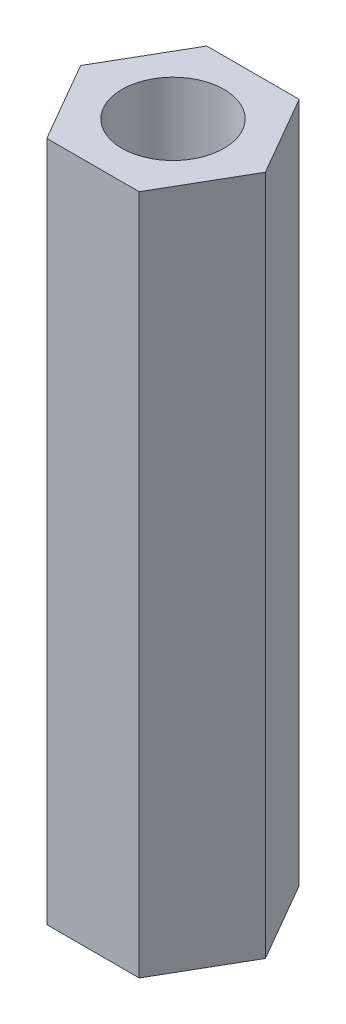
ISO-10303-21;
HEADER;
FILE_DESCRIPTION(('STEP AP214'),'2;1');
FILE_NAME('part.step','',(''),(''),'','','');
FILE_SCHEMA(('AUTOMOTIVE_DESIGN { 1 0 10303 214 1 1 1 1 }'));
ENDSEC;
DATA;
#1=APPLICATION_CONTEXT('core data for automotive mechanical design processes');
#2=APPLICATION_PROTOCOL_DEFINITION('international standard','automotive_design',2000,#1);
#3=PRODUCT_CONTEXT('',#1,'mechanical');
#4=PRODUCT('Part','Part','',(#3));
#5=PRODUCT_RELATED_PRODUCT_CATEGORY('part','',(#4));
#6=PRODUCT_DEFINITION_FORMATION('','',#4);
#7=PRODUCT_DEFINITION_CONTEXT('part definition',#1,'design');
#8=PRODUCT_DEFINITION('design','',#6,#7);
#9=PRODUCT_DEFINITION_SHAPE('','',#8);
#10=(LENGTH_UNIT() NAMED_UNIT(*) SI_UNIT(.MILLI.,.METRE.));
#11=(NAMED_UNIT(*) PLANE_ANGLE_UNIT() SI_UNIT($,.RADIAN.));
#12=(NAMED_UNIT(*) SI_UNIT($,.STERADIAN.) SOLID_ANGLE_UNIT());
#13=UNCERTAINTY_MEASURE_WITH_UNIT(LENGTH_MEASURE(1.E-05),#10,'distance_accuracy_value','');
#14=(GEOMETRIC_REPRESENTATION_CONTEXT(3) GLOBAL_UNCERTAINTY_ASSIGNED_CONTEXT((#13)) GLOBAL_UNIT_ASSIGNED_CONTEXT((#10,
#11,#12)) REPRESENTATION_CONTEXT('',''));
#15=CARTESIAN_POINT('',(0.,0.,0.));
#16=DIRECTION('',(0.,0.,1.));
#17=DIRECTION('',(1.,0.,0.));
#18=AXIS2_PLACEMENT_3D('',#15,#16,#17);
#19=CARTESIAN_POINT('',(0.,20.,0.));
#20=DIRECTION('',(0.,1.,0.));
#21=DIRECTION('',(0.,0.,1.));
#22=AXIS2_PLACEMENT_3D('',#19,#20,#21);
#23=PLANE('',#22);
#24=DIRECTION('',(0.499999999999999,0.,-0.866025403784439));
#25=VECTOR('',#24,1.);
#26=CARTESIAN_POINT('',(1.35677313259562,20.,2.35));
#27=LINE('',#26,#25);
#28=CARTESIAN_POINT('',(1.35677313259562,20.,2.35));
#29=VERTEX_POINT('',#28);
#30=CARTESIAN_POINT('',(2.71354626519124,20.,0.));
#31=VERTEX_POINT('',#30);
#32=EDGE_CURVE('E152',#29,#31,#27,.T.);
#33=ORIENTED_EDGE('',*,*,#32,.T.);
#34=DIRECTION('',(-0.5,0.,-0.866025403784438));
#35=VECTOR('',#34,1.);
#36=CARTESIAN_POINT('',(2.71354626519124,20.,0.));
#37=LINE('',#36,#35);
#38=CARTESIAN_POINT('',(1.35677313259562,20.,-2.35));
#39=VERTEX_POINT('',#38);
#40=EDGE_CURVE('E100',#31,#39,#37,.T.);
#41=ORIENTED_EDGE('',*,*,#40,.T.);
#42=DIRECTION('',(-1.,0.,0.));
#43=VECTOR('',#42,1.);
#44=CARTESIAN_POINT('',(1.35677313259562,20.,-2.35));
#45=LINE('',#44,#43);
#46=CARTESIAN_POINT('',(-1.35677313259562,20.,-2.35));
#47=VERTEX_POINT('',#46);
#48=EDGE_CURVE('E113',#39,#47,#45,.T.);
#49=ORIENTED_EDGE('',*,*,#48,.T.);
#50=DIRECTION('',(-0.5,0.,0.866025403784439));
#51=VECTOR('',#50,1.);
#52=CARTESIAN_POINT('',(-1.35677313259562,20.,-2.35));
#53=LINE('',#52,#51);
#54=CARTESIAN_POINT('',(-2.71354626519124,20.,0.));
#55=VERTEX_POINT('',#54);
#56=EDGE_CURVE('E107',#47,#55,#53,.T.);
#57=ORIENTED_EDGE('',*,*,#56,.T.);
#58=DIRECTION('',(0.5,0.,0.866025403784439));
#59=VECTOR('',#58,1.);
#60=CARTESIAN_POINT('',(-2.71354626519124,20.,0.));
#61=LINE('',#60,#59);
#62=CARTESIAN_POINT('',(-1.35677313259562,20.,2.35));
#63=VERTEX_POINT('',#62);
#64=EDGE_CURVE('E111',#55,#63,#61,.T.);
#65=ORIENTED_EDGE('',*,*,#64,.T.);
#66=DIRECTION('',(1.,0.,0.));
#67=VECTOR('',#66,1.);
#68=CARTESIAN_POINT('',(-1.35677313259562,20.,2.35));
#69=LINE('',#68,#67);
#70=EDGE_CURVE('E63',#63,#29,#69,.T.);
#71=ORIENTED_EDGE('',*,*,#70,.T.);
#72=EDGE_LOOP('',(#33,#41,#49,#57,#65,#71));
#73=FACE_BOUND('',#72,.T.);
#74=CARTESIAN_POINT('',(0.,20.,0.));
#75=DIRECTION('',(0.,1.,0.));
#76=DIRECTION('',(0.,0.,1.));
#77=AXIS2_PLACEMENT_3D('',#74,#75,#76);
#78=CIRCLE('',#77,1.5);
#79=CARTESIAN_POINT('',(0.,20.,1.5));
#80=VERTEX_POINT('',#79);
#81=EDGE_CURVE('E140',#80,#80,#78,.T.);
#82=ORIENTED_EDGE('',*,*,#81,.F.);
#83=EDGE_LOOP('',(#82));
#84=FACE_BOUND('',#83,.T.);
#85=ADVANCED_FACE('F45',(#73,#84),#23,.T.);
#86=CARTESIAN_POINT('',(0.,0.,0.));
#87=DIRECTION('',(0.,1.,0.));
#88=DIRECTION('',(0.,0.,1.));
#89=AXIS2_PLACEMENT_3D('',#86,#87,#88);
#90=PLANE('',#89);
#91=DIRECTION('',(0.499999999999999,0.,-0.866025403784439));
#92=VECTOR('',#91,1.);
#93=CARTESIAN_POINT('',(1.35677313259562,0.,2.35));
#94=LINE('',#93,#92);
#95=CARTESIAN_POINT('',(1.35677313259562,0.,2.35));
#96=VERTEX_POINT('',#95);
#97=CARTESIAN_POINT('',(2.71354626519124,0.,0.));
#98=VERTEX_POINT('',#97);
#99=EDGE_CURVE('E135',#96,#98,#94,.T.);
#100=ORIENTED_EDGE('',*,*,#99,.F.);
#101=DIRECTION('',(1.,0.,0.));
#102=VECTOR('',#101,1.);
#103=CARTESIAN_POINT('',(-1.35677313259562,0.,2.35));
#104=LINE('',#103,#102);
#105=CARTESIAN_POINT('',(-1.35677313259562,0.,2.35));
#106=VERTEX_POINT('',#105);
#107=EDGE_CURVE('E92',#106,#96,#104,.T.);
#108=ORIENTED_EDGE('',*,*,#107,.F.);
#109=DIRECTION('',(0.5,0.,0.866025403784439));
#110=VECTOR('',#109,1.);
#111=CARTESIAN_POINT('',(-2.71354626519124,0.,0.));
#112=LINE('',#111,#110);
#113=CARTESIAN_POINT('',(-2.71354626519124,0.,0.));
#114=VERTEX_POINT('',#113);
#115=EDGE_CURVE('E86',#114,#106,#112,.T.);
#116=ORIENTED_EDGE('',*,*,#115,.F.);
#117=DIRECTION('',(-0.5,0.,0.866025403784439));
#118=VECTOR('',#117,1.);
#119=CARTESIAN_POINT('',(-1.35677313259562,0.,-2.35));
#120=LINE('',#119,#118);
#121=CARTESIAN_POINT('',(-1.35677313259562,0.,-2.35));
#122=VERTEX_POINT('',#121);
#123=EDGE_CURVE('E122',#122,#114,#120,.T.);
#124=ORIENTED_EDGE('',*,*,#123,.F.);
#125=DIRECTION('',(-1.,0.,0.));
#126=VECTOR('',#125,1.);
#127=CARTESIAN_POINT('',(1.35677313259562,0.,-2.35));
#128=LINE('',#127,#126);
#129=CARTESIAN_POINT('',(1.35677313259562,0.,-2.35));
#130=VERTEX_POINT('',#129);
#131=EDGE_CURVE('E143',#130,#122,#128,.T.);
#132=ORIENTED_EDGE('',*,*,#131,.F.);
#133=DIRECTION('',(-0.5,0.,-0.866025403784438));
#134=VECTOR('',#133,1.);
#135=CARTESIAN_POINT('',(2.71354626519124,0.,0.));
#136=LINE('',#135,#134);
#137=EDGE_CURVE('E139',#98,#130,#136,.T.);
#138=ORIENTED_EDGE('',*,*,#137,.F.);
#139=EDGE_LOOP('',(#100,#108,#116,#124,#132,#138));
#140=FACE_BOUND('',#139,.T.);
#141=CARTESIAN_POINT('',(0.,0.,0.));
#142=DIRECTION('',(0.,1.,0.));
#143=DIRECTION('',(0.,0.,1.));
#144=AXIS2_PLACEMENT_3D('',#141,#142,#143);
#145=CIRCLE('',#144,1.5);
#146=CARTESIAN_POINT('',(0.,0.,1.5));
#147=VERTEX_POINT('',#146);
#148=EDGE_CURVE('E249',#147,#147,#145,.T.);
#149=ORIENTED_EDGE('',*,*,#148,.T.);
#150=EDGE_LOOP('',(#149));
#151=FACE_BOUND('',#150,.T.);
#152=ADVANCED_FACE('F165',(#140,#151),#90,.F.);
#153=CARTESIAN_POINT('',(1.35677313259562,20.,2.35));
#154=DIRECTION('',(-0.866025403784439,0.,-0.499999999999999));
#155=DIRECTION('',(-0.499999999999999,0.,0.866025403784439));
#156=AXIS2_PLACEMENT_3D('',#153,#154,#155);
#157=PLANE('',#156);
#158=ORIENTED_EDGE('',*,*,#99,.T.);
#159=DIRECTION('',(0.,-1.,0.));
#160=VECTOR('',#159,1.);
#161=CARTESIAN_POINT('',(2.71354626519124,20.,0.));
#162=LINE('',#161,#160);
#163=EDGE_CURVE('E11',#31,#98,#162,.T.);
#164=ORIENTED_EDGE('',*,*,#163,.F.);
#165=ORIENTED_EDGE('',*,*,#32,.F.);
#166=DIRECTION('',(0.,-1.,0.));
#167=VECTOR('',#166,1.);
#168=CARTESIAN_POINT('',(1.35677313259562,20.,2.35));
#169=LINE('',#168,#167);
#170=EDGE_CURVE('E131',#29,#96,#169,.T.);
#171=ORIENTED_EDGE('',*,*,#170,.T.);
#172=EDGE_LOOP('',(#158,#164,#165,#171));
#173=FACE_BOUND('',#172,.T.);
#174=ADVANCED_FACE('F47',(#173),#157,.F.);
#175=CARTESIAN_POINT('',(2.71354626519124,20.,0.));
#176=DIRECTION('',(-0.866025403784438,0.,0.5));
#177=DIRECTION('',(0.5,0.,0.866025403784438));
#178=AXIS2_PLACEMENT_3D('',#175,#176,#177);
#179=PLANE('',#178);
#180=ORIENTED_EDGE('',*,*,#137,.T.);
#181=DIRECTION('',(0.,-1.,0.));
#182=VECTOR('',#181,1.);
#183=CARTESIAN_POINT('',(1.35677313259562,20.,-2.35));
#184=LINE('',#183,#182);
#185=EDGE_CURVE('E55',#39,#130,#184,.T.);
#186=ORIENTED_EDGE('',*,*,#185,.F.);
#187=ORIENTED_EDGE('',*,*,#40,.F.);
#188=ORIENTED_EDGE('',*,*,#163,.T.);
#189=EDGE_LOOP('',(#180,#186,#187,#188));
#190=FACE_BOUND('',#189,.T.);
#191=ADVANCED_FACE('F190',(#190),#179,.F.);
#192=CARTESIAN_POINT('',(1.35677313259562,20.,-2.35));
#193=DIRECTION('',(0.,0.,1.));
#194=DIRECTION('',(1.,0.,0.));
#195=AXIS2_PLACEMENT_3D('',#192,#193,#194);
#196=PLANE('',#195);
#197=ORIENTED_EDGE('',*,*,#131,.T.);
#198=DIRECTION('',(0.,-1.,0.));
#199=VECTOR('',#198,1.);
#200=CARTESIAN_POINT('',(-1.35677313259562,20.,-2.35));
#201=LINE('',#200,#199);
#202=EDGE_CURVE('E124',#47,#122,#201,.T.);
#203=ORIENTED_EDGE('',*,*,#202,.F.);
#204=ORIENTED_EDGE('',*,*,#48,.F.);
#205=ORIENTED_EDGE('',*,*,#185,.T.);
#206=EDGE_LOOP('',(#197,#203,#204,#205));
#207=FACE_BOUND('',#206,.T.);
#208=ADVANCED_FACE('F162',(#207),#196,.F.);
#209=CARTESIAN_POINT('',(-1.35677313259562,20.,-2.35));
#210=DIRECTION('',(0.866025403784439,0.,0.5));
#211=DIRECTION('',(0.5,0.,-0.866025403784439));
#212=AXIS2_PLACEMENT_3D('',#209,#210,#211);
#213=PLANE('',#212);
#214=ORIENTED_EDGE('',*,*,#123,.T.);
#215=DIRECTION('',(0.,-1.,0.));
#216=VECTOR('',#215,1.);
#217=CARTESIAN_POINT('',(-2.71354626519124,20.,0.));
#218=LINE('',#217,#216);
#219=EDGE_CURVE('E119',#55,#114,#218,.T.);
#220=ORIENTED_EDGE('',*,*,#219,.F.);
#221=ORIENTED_EDGE('',*,*,#56,.F.);
#222=ORIENTED_EDGE('',*,*,#202,.T.);
#223=EDGE_LOOP('',(#214,#220,#221,#222));
#224=FACE_BOUND('',#223,.T.);
#225=ADVANCED_FACE('F120',(#224),#213,.F.);
#226=CARTESIAN_POINT('',(-2.71354626519124,20.,0.));
#227=DIRECTION('',(0.866025403784438,0.,-0.5));
#228=DIRECTION('',(-0.5,0.,-0.866025403784439));
#229=AXIS2_PLACEMENT_3D('',#226,#227,#228);
#230=PLANE('',#229);
#231=ORIENTED_EDGE('',*,*,#115,.T.);
#232=DIRECTION('',(0.,-1.,0.));
#233=VECTOR('',#232,1.);
#234=CARTESIAN_POINT('',(-1.35677313259562,20.,2.35));
#235=LINE('',#234,#233);
#236=EDGE_CURVE('E125',#63,#106,#235,.T.);
#237=ORIENTED_EDGE('',*,*,#236,.F.);
#238=ORIENTED_EDGE('',*,*,#64,.F.);
#239=ORIENTED_EDGE('',*,*,#219,.T.);
#240=EDGE_LOOP('',(#231,#237,#238,#239));
#241=FACE_BOUND('',#240,.T.);
#242=ADVANCED_FACE('F127',(#241),#230,.F.);
#243=CARTESIAN_POINT('',(-1.35677313259562,20.,2.35));
#244=DIRECTION('',(0.,0.,-1.));
#245=DIRECTION('',(-1.,0.,0.));
#246=AXIS2_PLACEMENT_3D('',#243,#244,#245);
#247=PLANE('',#246);
#248=ORIENTED_EDGE('',*,*,#107,.T.);
#249=ORIENTED_EDGE('',*,*,#170,.F.);
#250=ORIENTED_EDGE('',*,*,#70,.F.);
#251=ORIENTED_EDGE('',*,*,#236,.T.);
#252=EDGE_LOOP('',(#248,#249,#250,#251));
#253=FACE_BOUND('',#252,.T.);
#254=ADVANCED_FACE('F170',(#253),#247,.F.);
#255=CARTESIAN_POINT('',(0.,20.,0.));
#256=DIRECTION('',(0.,-1.,0.));
#257=DIRECTION('',(0.,0.,-1.));
#258=AXIS2_PLACEMENT_3D('',#255,#256,#257);
#259=CYLINDRICAL_SURFACE('',#258,1.5);
#260=ORIENTED_EDGE('',*,*,#81,.T.);
#261=EDGE_LOOP('',(#260));
#262=FACE_BOUND('',#261,.T.);
#263=ORIENTED_EDGE('',*,*,#148,.F.);
#264=EDGE_LOOP('',(#263));
#265=FACE_BOUND('',#264,.T.);
#266=ADVANCED_FACE('F172',(#262,#265),#259,.F.);
#267=CLOSED_SHELL('',(#85,#152,#174,#191,#208,#225,#242,#254,#266));
#268=MANIFOLD_SOLID_BREP('B2',#267);
#269=ADVANCED_BREP_SHAPE_REPRESENTATION('',(#18,#268),#14);
#270=SHAPE_DEFINITION_REPRESENTATION(#9,#269);
ENDSEC;
END-ISO-10303-21;
